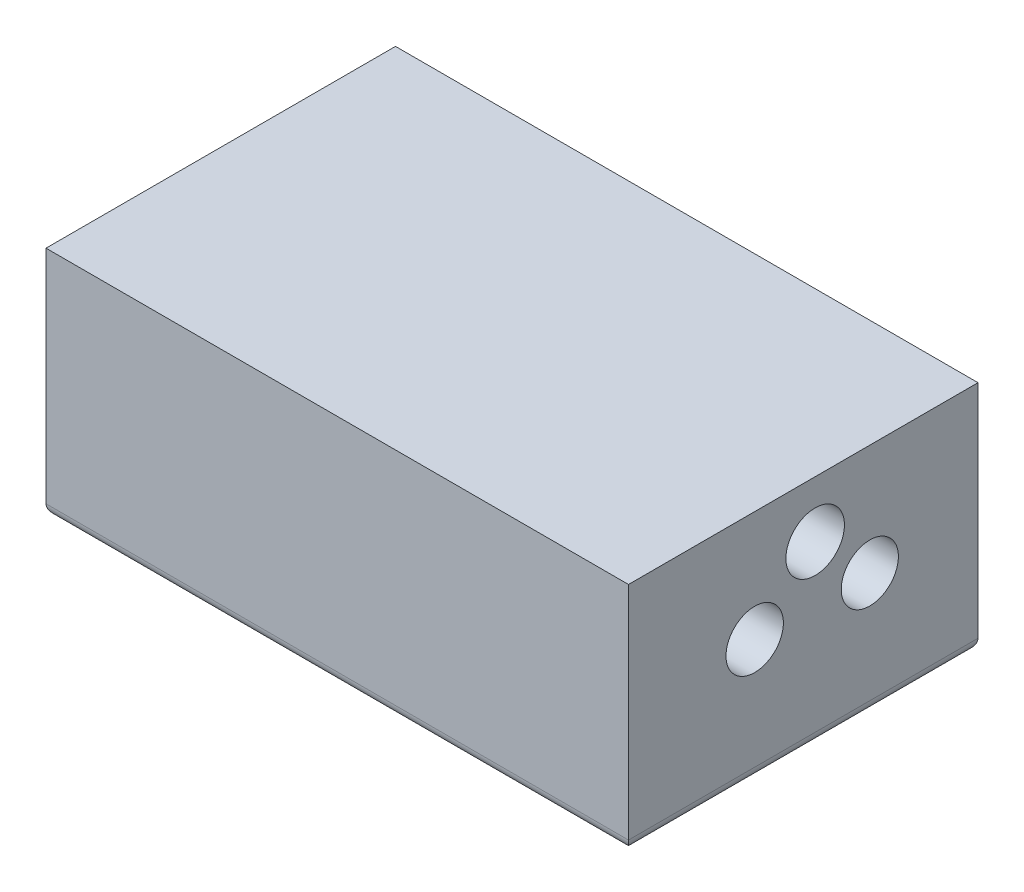
ISO-10303-21;
HEADER;
FILE_DESCRIPTION(('STEP AP214'),'2;1');
FILE_NAME('part.step','',(''),(''),'','','');
FILE_SCHEMA(('AUTOMOTIVE_DESIGN { 1 0 10303 214 1 1 1 1 }'));
ENDSEC;
DATA;
#1=APPLICATION_CONTEXT('core data for automotive mechanical design processes');
#2=APPLICATION_PROTOCOL_DEFINITION('international standard','automotive_design',2000,#1);
#3=PRODUCT_CONTEXT('',#1,'mechanical');
#4=PRODUCT('Part','Part','',(#3));
#5=PRODUCT_RELATED_PRODUCT_CATEGORY('part','',(#4));
#6=PRODUCT_DEFINITION_FORMATION('','',#4);
#7=PRODUCT_DEFINITION_CONTEXT('part definition',#1,'design');
#8=PRODUCT_DEFINITION('design','',#6,#7);
#9=PRODUCT_DEFINITION_SHAPE('','',#8);
#10=(LENGTH_UNIT() NAMED_UNIT(*) SI_UNIT(.MILLI.,.METRE.));
#11=(NAMED_UNIT(*) PLANE_ANGLE_UNIT() SI_UNIT($,.RADIAN.));
#12=(NAMED_UNIT(*) SI_UNIT($,.STERADIAN.) SOLID_ANGLE_UNIT());
#13=UNCERTAINTY_MEASURE_WITH_UNIT(LENGTH_MEASURE(1.E-05),#10,'distance_accuracy_value','');
#14=(GEOMETRIC_REPRESENTATION_CONTEXT(3) GLOBAL_UNCERTAINTY_ASSIGNED_CONTEXT((#13)) GLOBAL_UNIT_ASSIGNED_CONTEXT((#10,
#11,#12)) REPRESENTATION_CONTEXT('',''));
#15=CARTESIAN_POINT('',(0.,0.,0.));
#16=DIRECTION('',(0.,0.,1.));
#17=DIRECTION('',(1.,0.,0.));
#18=AXIS2_PLACEMENT_3D('',#15,#16,#17);
#19=CARTESIAN_POINT('',(-63.5,50.8,-38.1));
#20=DIRECTION('',(1.,0.,0.));
#21=DIRECTION('',(0.,0.,-1.));
#22=AXIS2_PLACEMENT_3D('',#19,#20,#21);
#23=PLANE('',#22);
#24=DIRECTION('',(0.,-1.,0.));
#25=VECTOR('',#24,1.);
#26=CARTESIAN_POINT('',(-63.5,50.8,-38.1));
#27=LINE('',#26,#25);
#28=CARTESIAN_POINT('',(-63.5,50.8,-38.1));
#29=VERTEX_POINT('',#28);
#30=CARTESIAN_POINT('',(-63.5,2.54,-38.1));
#31=VERTEX_POINT('',#30);
#32=EDGE_CURVE('E159',#29,#31,#27,.T.);
#33=ORIENTED_EDGE('',*,*,#32,.T.);
#34=DIRECTION('',(0.,0.,1.));
#35=VECTOR('',#34,1.);
#36=CARTESIAN_POINT('',(-63.5,2.54,-38.1));
#37=LINE('',#36,#35);
#38=CARTESIAN_POINT('',(-63.5,2.54,38.1));
#39=VERTEX_POINT('',#38);
#40=EDGE_CURVE('E59',#31,#39,#37,.T.);
#41=ORIENTED_EDGE('',*,*,#40,.T.);
#42=DIRECTION('',(0.,-1.,0.));
#43=VECTOR('',#42,1.);
#44=CARTESIAN_POINT('',(-63.5,50.8,38.1));
#45=LINE('',#44,#43);
#46=CARTESIAN_POINT('',(-63.5,50.8,38.1));
#47=VERTEX_POINT('',#46);
#48=EDGE_CURVE('E91',#47,#39,#45,.T.);
#49=ORIENTED_EDGE('',*,*,#48,.F.);
#50=DIRECTION('',(0.,0.,1.));
#51=VECTOR('',#50,1.);
#52=CARTESIAN_POINT('',(-63.5,50.8,-38.1));
#53=LINE('',#52,#51);
#54=EDGE_CURVE('E96',#29,#47,#53,.T.);
#55=ORIENTED_EDGE('',*,*,#54,.F.);
#56=EDGE_LOOP('',(#33,#41,#49,#55));
#57=FACE_BOUND('',#56,.T.);
#58=ADVANCED_FACE('F35',(#57),#23,.F.);
#59=CARTESIAN_POINT('',(-63.5,50.8,38.1));
#60=DIRECTION('',(0.,0.,-1.));
#61=DIRECTION('',(-1.,0.,0.));
#62=AXIS2_PLACEMENT_3D('',#59,#60,#61);
#63=PLANE('',#62);
#64=ORIENTED_EDGE('',*,*,#48,.T.);
#65=DIRECTION('',(1.,0.,0.));
#66=VECTOR('',#65,1.);
#67=CARTESIAN_POINT('',(-63.5,2.54,38.1));
#68=LINE('',#67,#66);
#69=CARTESIAN_POINT('',(63.5,2.54,38.1));
#70=VERTEX_POINT('',#69);
#71=EDGE_CURVE('E44',#39,#70,#68,.T.);
#72=ORIENTED_EDGE('',*,*,#71,.T.);
#73=DIRECTION('',(0.,-1.,0.));
#74=VECTOR('',#73,1.);
#75=CARTESIAN_POINT('',(63.5,50.8,38.1));
#76=LINE('',#75,#74);
#77=CARTESIAN_POINT('',(63.5,50.8,38.1));
#78=VERTEX_POINT('',#77);
#79=EDGE_CURVE('E92',#78,#70,#76,.T.);
#80=ORIENTED_EDGE('',*,*,#79,.F.);
#81=DIRECTION('',(1.,0.,0.));
#82=VECTOR('',#81,1.);
#83=CARTESIAN_POINT('',(-63.5,50.8,38.1));
#84=LINE('',#83,#82);
#85=EDGE_CURVE('E88',#47,#78,#84,.T.);
#86=ORIENTED_EDGE('',*,*,#85,.F.);
#87=EDGE_LOOP('',(#64,#72,#80,#86));
#88=FACE_BOUND('',#87,.T.);
#89=ADVANCED_FACE('F90',(#88),#63,.F.);
#90=CARTESIAN_POINT('',(63.5,50.8,-38.1));
#91=DIRECTION('',(-1.,0.,0.));
#92=DIRECTION('',(0.,0.,1.));
#93=AXIS2_PLACEMENT_3D('',#90,#91,#92);
#94=PLANE('',#93);
#95=CARTESIAN_POINT('',(63.5,38.5286638569227,-2.59811340141347));
#96=DIRECTION('',(1.,0.,0.));
#97=DIRECTION('',(0.,0.,-1.));
#98=AXIS2_PLACEMENT_3D('',#95,#96,#97);
#99=CIRCLE('',#98,6.38236986153384);
#100=CARTESIAN_POINT('',(63.5,38.5286638569227,-8.98048326294731));
#101=VERTEX_POINT('',#100);
#102=EDGE_CURVE('E133',#101,#101,#99,.T.);
#103=ORIENTED_EDGE('',*,*,#102,.F.);
#104=EDGE_LOOP('',(#103));
#105=FACE_BOUND('',#104,.T.);
#106=CARTESIAN_POINT('',(63.5,26.67,-14.5124216809336));
#107=DIRECTION('',(1.,0.,0.));
#108=DIRECTION('',(0.,0.,-1.));
#109=AXIS2_PLACEMENT_3D('',#106,#107,#108);
#110=CIRCLE('',#109,6.233963983332);
#111=CARTESIAN_POINT('',(63.5,26.67,-20.7463856642656));
#112=VERTEX_POINT('',#111);
#113=EDGE_CURVE('E147',#112,#112,#110,.T.);
#114=ORIENTED_EDGE('',*,*,#113,.F.);
#115=EDGE_LOOP('',(#114));
#116=FACE_BOUND('',#115,.T.);
#117=CARTESIAN_POINT('',(63.5,26.67,10.58690142274));
#118=DIRECTION('',(1.,0.,0.));
#119=DIRECTION('',(0.,0.,-1.));
#120=AXIS2_PLACEMENT_3D('',#117,#118,#119);
#121=CIRCLE('',#120,6.26022475948629);
#122=CARTESIAN_POINT('',(63.5,26.67,4.3266766632537));
#123=VERTEX_POINT('',#122);
#124=EDGE_CURVE('E150',#123,#123,#121,.T.);
#125=ORIENTED_EDGE('',*,*,#124,.F.);
#126=EDGE_LOOP('',(#125));
#127=FACE_BOUND('',#126,.T.);
#128=ORIENTED_EDGE('',*,*,#79,.T.);
#129=DIRECTION('',(0.,0.,-1.));
#130=VECTOR('',#129,1.);
#131=CARTESIAN_POINT('',(63.5,2.54,-38.1));
#132=LINE('',#131,#130);
#133=CARTESIAN_POINT('',(63.5,2.54,-38.1));
#134=VERTEX_POINT('',#133);
#135=EDGE_CURVE('E11',#70,#134,#132,.T.);
#136=ORIENTED_EDGE('',*,*,#135,.T.);
#137=DIRECTION('',(0.,-1.,0.));
#138=VECTOR('',#137,1.);
#139=CARTESIAN_POINT('',(63.5,50.8,-38.1));
#140=LINE('',#139,#138);
#141=CARTESIAN_POINT('',(63.5,50.8,-38.1));
#142=VERTEX_POINT('',#141);
#143=EDGE_CURVE('E110',#142,#134,#140,.T.);
#144=ORIENTED_EDGE('',*,*,#143,.F.);
#145=DIRECTION('',(0.,0.,-1.));
#146=VECTOR('',#145,1.);
#147=CARTESIAN_POINT('',(63.5,50.8,-38.1));
#148=LINE('',#147,#146);
#149=EDGE_CURVE('E95',#78,#142,#148,.T.);
#150=ORIENTED_EDGE('',*,*,#149,.F.);
#151=EDGE_LOOP('',(#128,#136,#144,#150));
#152=FACE_BOUND('',#151,.T.);
#153=ADVANCED_FACE('F185',(#105,#116,#127,#152),#94,.F.);
#154=CARTESIAN_POINT('',(-63.5,50.8,-38.1));
#155=DIRECTION('',(0.,0.,1.));
#156=DIRECTION('',(1.,0.,0.));
#157=AXIS2_PLACEMENT_3D('',#154,#155,#156);
#158=PLANE('',#157);
#159=ORIENTED_EDGE('',*,*,#143,.T.);
#160=DIRECTION('',(-1.,0.,0.));
#161=VECTOR('',#160,1.);
#162=CARTESIAN_POINT('',(-63.5,2.54,-38.1));
#163=LINE('',#162,#161);
#164=EDGE_CURVE('E105',#134,#31,#163,.T.);
#165=ORIENTED_EDGE('',*,*,#164,.T.);
#166=ORIENTED_EDGE('',*,*,#32,.F.);
#167=DIRECTION('',(-1.,0.,0.));
#168=VECTOR('',#167,1.);
#169=CARTESIAN_POINT('',(-63.5,50.8,-38.1));
#170=LINE('',#169,#168);
#171=EDGE_CURVE('E101',#142,#29,#170,.T.);
#172=ORIENTED_EDGE('',*,*,#171,.F.);
#173=EDGE_LOOP('',(#159,#165,#166,#172));
#174=FACE_BOUND('',#173,.T.);
#175=ADVANCED_FACE('F164',(#174),#158,.F.);
#176=CARTESIAN_POINT('',(0.,50.8,0.));
#177=DIRECTION('',(0.,1.,0.));
#178=DIRECTION('',(0.,0.,1.));
#179=AXIS2_PLACEMENT_3D('',#176,#177,#178);
#180=PLANE('',#179);
#181=ORIENTED_EDGE('',*,*,#54,.T.);
#182=ORIENTED_EDGE('',*,*,#85,.T.);
#183=ORIENTED_EDGE('',*,*,#149,.T.);
#184=ORIENTED_EDGE('',*,*,#171,.T.);
#185=EDGE_LOOP('',(#181,#182,#183,#184));
#186=FACE_BOUND('',#185,.T.);
#187=ADVANCED_FACE('F99',(#186),#180,.T.);
#188=CARTESIAN_POINT('',(0.,0.,0.));
#189=DIRECTION('',(0.,1.,0.));
#190=DIRECTION('',(0.,0.,1.));
#191=AXIS2_PLACEMENT_3D('',#188,#189,#190);
#192=PLANE('',#191);
#193=DIRECTION('',(0.,0.,1.));
#194=VECTOR('',#193,1.);
#195=CARTESIAN_POINT('',(-60.96,0.,0.));
#196=LINE('',#195,#194);
#197=CARTESIAN_POINT('',(-60.96,0.,35.56));
#198=VERTEX_POINT('',#197);
#199=CARTESIAN_POINT('',(-60.96,0.,-35.56));
#200=VERTEX_POINT('',#199);
#201=EDGE_CURVE('E117',#198,#200,#196,.F.);
#202=ORIENTED_EDGE('',*,*,#201,.T.);
#203=DIRECTION('',(-1.,0.,0.));
#204=VECTOR('',#203,1.);
#205=CARTESIAN_POINT('',(0.,0.,-35.56));
#206=LINE('',#205,#204);
#207=CARTESIAN_POINT('',(60.96,0.,-35.56));
#208=VERTEX_POINT('',#207);
#209=EDGE_CURVE('E119',#200,#208,#206,.F.);
#210=ORIENTED_EDGE('',*,*,#209,.T.);
#211=DIRECTION('',(0.,0.,-1.));
#212=VECTOR('',#211,1.);
#213=CARTESIAN_POINT('',(60.96,0.,0.));
#214=LINE('',#213,#212);
#215=CARTESIAN_POINT('',(60.96,0.,35.56));
#216=VERTEX_POINT('',#215);
#217=EDGE_CURVE('E108',#208,#216,#214,.F.);
#218=ORIENTED_EDGE('',*,*,#217,.T.);
#219=DIRECTION('',(1.,0.,0.));
#220=VECTOR('',#219,1.);
#221=CARTESIAN_POINT('',(0.,0.,35.56));
#222=LINE('',#221,#220);
#223=EDGE_CURVE('E115',#216,#198,#222,.F.);
#224=ORIENTED_EDGE('',*,*,#223,.T.);
#225=EDGE_LOOP('',(#202,#210,#218,#224));
#226=FACE_BOUND('',#225,.T.);
#227=ADVANCED_FACE('F193',(#226),#192,.F.);
#228=CARTESIAN_POINT('',(48.26,26.67,10.58690142274));
#229=DIRECTION('',(1.,0.,0.));
#230=DIRECTION('',(0.,0.,-1.));
#231=AXIS2_PLACEMENT_3D('',#228,#229,#230);
#232=CYLINDRICAL_SURFACE('',#231,6.26022475948629);
#233=CARTESIAN_POINT('',(48.26,26.67,10.58690142274));
#234=DIRECTION('',(1.,0.,0.));
#235=DIRECTION('',(0.,0.,-1.));
#236=AXIS2_PLACEMENT_3D('',#233,#234,#235);
#237=CIRCLE('',#236,6.26022475948629);
#238=CARTESIAN_POINT('',(48.26,26.67,4.3266766632537));
#239=VERTEX_POINT('',#238);
#240=EDGE_CURVE('E103',#239,#239,#237,.T.);
#241=CARTESIAN_POINT('',(48.26,26.67,4.3266766632537));
#242=CARTESIAN_POINT('',(48.41875,26.67,4.3266766632537));
#243=CARTESIAN_POINT('',(48.5775,26.67,4.3266766632537));
#244=CARTESIAN_POINT('',(48.895,26.67,4.3266766632537));
#245=CARTESIAN_POINT('',(49.05375,26.67,4.3266766632537));
#246=CARTESIAN_POINT('',(49.37125,26.67,4.3266766632537));
#247=CARTESIAN_POINT('',(49.53,26.67,4.3266766632537));
#248=CARTESIAN_POINT('',(49.8475,26.67,4.3266766632537));
#249=CARTESIAN_POINT('',(50.00625,26.67,4.3266766632537));
#250=CARTESIAN_POINT('',(50.32375,26.67,4.3266766632537));
#251=CARTESIAN_POINT('',(50.4825,26.67,4.3266766632537));
#252=CARTESIAN_POINT('',(50.8,26.67,4.3266766632537));
#253=CARTESIAN_POINT('',(50.95875,26.67,4.3266766632537));
#254=CARTESIAN_POINT('',(51.27625,26.67,4.3266766632537));
#255=CARTESIAN_POINT('',(51.435,26.67,4.3266766632537));
#256=CARTESIAN_POINT('',(51.7525,26.67,4.3266766632537));
#257=CARTESIAN_POINT('',(51.91125,26.67,4.3266766632537));
#258=CARTESIAN_POINT('',(52.22875,26.67,4.3266766632537));
#259=CARTESIAN_POINT('',(52.3875,26.67,4.3266766632537));
#260=CARTESIAN_POINT('',(52.705,26.67,4.3266766632537));
#261=CARTESIAN_POINT('',(52.86375,26.67,4.3266766632537));
#262=CARTESIAN_POINT('',(53.18125,26.67,4.3266766632537));
#263=CARTESIAN_POINT('',(53.34,26.67,4.3266766632537));
#264=CARTESIAN_POINT('',(53.6575,26.67,4.3266766632537));
#265=CARTESIAN_POINT('',(53.81625,26.67,4.3266766632537));
#266=CARTESIAN_POINT('',(54.13375,26.67,4.3266766632537));
#267=CARTESIAN_POINT('',(54.2925,26.67,4.3266766632537));
#268=CARTESIAN_POINT('',(54.61,26.67,4.3266766632537));
#269=CARTESIAN_POINT('',(54.76875,26.67,4.3266766632537));
#270=CARTESIAN_POINT('',(55.08625,26.67,4.3266766632537));
#271=CARTESIAN_POINT('',(55.245,26.67,4.3266766632537));
#272=CARTESIAN_POINT('',(55.5625,26.67,4.3266766632537));
#273=CARTESIAN_POINT('',(55.72125,26.67,4.3266766632537));
#274=CARTESIAN_POINT('',(56.03875,26.67,4.3266766632537));
#275=CARTESIAN_POINT('',(56.1975,26.67,4.3266766632537));
#276=CARTESIAN_POINT('',(56.515,26.67,4.3266766632537));
#277=CARTESIAN_POINT('',(56.67375,26.67,4.3266766632537));
#278=CARTESIAN_POINT('',(56.99125,26.67,4.3266766632537));
#279=CARTESIAN_POINT('',(57.15,26.67,4.3266766632537));
#280=CARTESIAN_POINT('',(57.4675,26.67,4.3266766632537));
#281=CARTESIAN_POINT('',(57.62625,26.67,4.3266766632537));
#282=CARTESIAN_POINT('',(57.94375,26.67,4.3266766632537));
#283=CARTESIAN_POINT('',(58.1025,26.67,4.3266766632537));
#284=CARTESIAN_POINT('',(58.42,26.67,4.3266766632537));
#285=CARTESIAN_POINT('',(58.57875,26.67,4.3266766632537));
#286=CARTESIAN_POINT('',(58.89625,26.67,4.3266766632537));
#287=CARTESIAN_POINT('',(59.055,26.67,4.3266766632537));
#288=CARTESIAN_POINT('',(59.3725,26.67,4.3266766632537));
#289=CARTESIAN_POINT('',(59.53125,26.67,4.3266766632537));
#290=CARTESIAN_POINT('',(59.84875,26.67,4.3266766632537));
#291=CARTESIAN_POINT('',(60.0075,26.67,4.3266766632537));
#292=CARTESIAN_POINT('',(60.325,26.67,4.3266766632537));
#293=CARTESIAN_POINT('',(60.48375,26.67,4.3266766632537));
#294=CARTESIAN_POINT('',(60.80125,26.67,4.3266766632537));
#295=CARTESIAN_POINT('',(60.96,26.67,4.3266766632537));
#296=CARTESIAN_POINT('',(61.2775,26.67,4.3266766632537));
#297=CARTESIAN_POINT('',(61.43625,26.67,4.3266766632537));
#298=CARTESIAN_POINT('',(61.75375,26.67,4.3266766632537));
#299=CARTESIAN_POINT('',(61.9125,26.67,4.3266766632537));
#300=CARTESIAN_POINT('',(62.23,26.67,4.3266766632537));
#301=CARTESIAN_POINT('',(62.38875,26.67,4.3266766632537));
#302=CARTESIAN_POINT('',(62.70625,26.67,4.3266766632537));
#303=CARTESIAN_POINT('',(62.865,26.67,4.3266766632537));
#304=CARTESIAN_POINT('',(63.1825,26.67,4.3266766632537));
#305=CARTESIAN_POINT('',(63.34125,26.67,4.3266766632537));
#306=CARTESIAN_POINT('',(63.5,26.67,4.3266766632537));
#307=B_SPLINE_CURVE_WITH_KNOTS('',3,(#241,#242,#243,#244,#245,#246,#247,#248,#249,#250,#251,
#252,#253,#254,#255,#256,#257,#258,#259,#260,#261,#262,#263,#264,#265,#266,#267,#268,#269,#270,
#271,#272,#273,#274,#275,#276,#277,#278,#279,#280,#281,#282,#283,#284,#285,#286,#287,#288,#289,
#290,#291,#292,#293,#294,#295,#296,#297,#298,#299,#300,#301,#302,#303,#304,#305,#306),
.UNSPECIFIED.,.F.,.F.,(4,2,2,2,2,2,2,2,2,2,2,2,2,2,2,2,2,2,2,2,2,2,2,2,2,2,2,2,2,2,2,2,4),(0.,
0.476250000000004,0.952500000000002,1.42875000000001,1.905,2.38125,2.85750000000001,3.33375,
3.81,4.28625000000001,4.7625,5.23875000000001,5.71500000000001,6.19125,6.66750000000001,7.14375,
7.62,8.09625000000001,8.5725,9.04875,9.52500000000001,10.00125,10.4775,10.95375,11.43,11.90625,
12.3825,12.85875,13.335,13.81125,14.2875,14.76375,15.24),.UNSPECIFIED.);
#308=EDGE_CURVE('BSEAM196',#239,#123,#307,.T.);
#309=ORIENTED_EDGE('',*,*,#240,.F.);
#310=ORIENTED_EDGE('',*,*,#124,.T.);
#311=ORIENTED_EDGE('',*,*,#308,.T.);
#312=ORIENTED_EDGE('',*,*,#308,.F.);
#313=EDGE_LOOP('',(#309,#311,#310,#312));
#314=FACE_BOUND('',#313,.T.);
#315=ADVANCED_FACE('F196',(#314),#232,.F.);
#316=CARTESIAN_POINT('',(48.26,26.67,10.58690142274));
#317=DIRECTION('',(1.,0.,0.));
#318=DIRECTION('',(0.,0.,-1.));
#319=AXIS2_PLACEMENT_3D('',#316,#317,#318);
#320=PLANE('',#319);
#321=ORIENTED_EDGE('',*,*,#240,.T.);
#322=EDGE_LOOP('',(#321));
#323=FACE_BOUND('',#322,.T.);
#324=ADVANCED_FACE('F202',(#323),#320,.T.);
#325=CARTESIAN_POINT('',(48.26,26.67,-14.5124216809336));
#326=DIRECTION('',(1.,0.,0.));
#327=DIRECTION('',(0.,0.,-1.));
#328=AXIS2_PLACEMENT_3D('',#325,#326,#327);
#329=CYLINDRICAL_SURFACE('',#328,6.233963983332);
#330=CARTESIAN_POINT('',(48.26,26.67,-14.5124216809336));
#331=DIRECTION('',(1.,0.,0.));
#332=DIRECTION('',(0.,0.,-1.));
#333=AXIS2_PLACEMENT_3D('',#330,#331,#332);
#334=CIRCLE('',#333,6.233963983332);
#335=CARTESIAN_POINT('',(48.26,26.67,-20.7463856642656));
#336=VERTEX_POINT('',#335);
#337=EDGE_CURVE('E144',#336,#336,#334,.T.);
#338=CARTESIAN_POINT('',(48.26,26.67,-20.7463856642656));
#339=CARTESIAN_POINT('',(48.41875,26.67,-20.7463856642656));
#340=CARTESIAN_POINT('',(48.5775,26.67,-20.7463856642656));
#341=CARTESIAN_POINT('',(48.895,26.67,-20.7463856642656));
#342=CARTESIAN_POINT('',(49.05375,26.67,-20.7463856642656));
#343=CARTESIAN_POINT('',(49.37125,26.67,-20.7463856642656));
#344=CARTESIAN_POINT('',(49.53,26.67,-20.7463856642656));
#345=CARTESIAN_POINT('',(49.8475,26.67,-20.7463856642656));
#346=CARTESIAN_POINT('',(50.00625,26.67,-20.7463856642656));
#347=CARTESIAN_POINT('',(50.32375,26.67,-20.7463856642656));
#348=CARTESIAN_POINT('',(50.4825,26.67,-20.7463856642656));
#349=CARTESIAN_POINT('',(50.8,26.67,-20.7463856642656));
#350=CARTESIAN_POINT('',(50.95875,26.67,-20.7463856642656));
#351=CARTESIAN_POINT('',(51.27625,26.67,-20.7463856642656));
#352=CARTESIAN_POINT('',(51.435,26.67,-20.7463856642656));
#353=CARTESIAN_POINT('',(51.7525,26.67,-20.7463856642656));
#354=CARTESIAN_POINT('',(51.91125,26.67,-20.7463856642656));
#355=CARTESIAN_POINT('',(52.22875,26.67,-20.7463856642656));
#356=CARTESIAN_POINT('',(52.3875,26.67,-20.7463856642656));
#357=CARTESIAN_POINT('',(52.705,26.67,-20.7463856642656));
#358=CARTESIAN_POINT('',(52.86375,26.67,-20.7463856642656));
#359=CARTESIAN_POINT('',(53.18125,26.67,-20.7463856642656));
#360=CARTESIAN_POINT('',(53.34,26.67,-20.7463856642656));
#361=CARTESIAN_POINT('',(53.6575,26.67,-20.7463856642656));
#362=CARTESIAN_POINT('',(53.81625,26.67,-20.7463856642656));
#363=CARTESIAN_POINT('',(54.13375,26.67,-20.7463856642656));
#364=CARTESIAN_POINT('',(54.2925,26.67,-20.7463856642656));
#365=CARTESIAN_POINT('',(54.61,26.67,-20.7463856642656));
#366=CARTESIAN_POINT('',(54.76875,26.67,-20.7463856642656));
#367=CARTESIAN_POINT('',(55.08625,26.67,-20.7463856642656));
#368=CARTESIAN_POINT('',(55.245,26.67,-20.7463856642656));
#369=CARTESIAN_POINT('',(55.5625,26.67,-20.7463856642656));
#370=CARTESIAN_POINT('',(55.72125,26.67,-20.7463856642656));
#371=CARTESIAN_POINT('',(56.03875,26.67,-20.7463856642656));
#372=CARTESIAN_POINT('',(56.1975,26.67,-20.7463856642656));
#373=CARTESIAN_POINT('',(56.515,26.67,-20.7463856642656));
#374=CARTESIAN_POINT('',(56.67375,26.67,-20.7463856642656));
#375=CARTESIAN_POINT('',(56.99125,26.67,-20.7463856642656));
#376=CARTESIAN_POINT('',(57.15,26.67,-20.7463856642656));
#377=CARTESIAN_POINT('',(57.4675,26.67,-20.7463856642656));
#378=CARTESIAN_POINT('',(57.62625,26.67,-20.7463856642656));
#379=CARTESIAN_POINT('',(57.94375,26.67,-20.7463856642656));
#380=CARTESIAN_POINT('',(58.1025,26.67,-20.7463856642656));
#381=CARTESIAN_POINT('',(58.42,26.67,-20.7463856642656));
#382=CARTESIAN_POINT('',(58.57875,26.67,-20.7463856642656));
#383=CARTESIAN_POINT('',(58.89625,26.67,-20.7463856642656));
#384=CARTESIAN_POINT('',(59.055,26.67,-20.7463856642656));
#385=CARTESIAN_POINT('',(59.3725,26.67,-20.7463856642656));
#386=CARTESIAN_POINT('',(59.53125,26.67,-20.7463856642656));
#387=CARTESIAN_POINT('',(59.84875,26.67,-20.7463856642656));
#388=CARTESIAN_POINT('',(60.0075,26.67,-20.7463856642656));
#389=CARTESIAN_POINT('',(60.325,26.67,-20.7463856642656));
#390=CARTESIAN_POINT('',(60.48375,26.67,-20.7463856642656));
#391=CARTESIAN_POINT('',(60.80125,26.67,-20.7463856642656));
#392=CARTESIAN_POINT('',(60.96,26.67,-20.7463856642656));
#393=CARTESIAN_POINT('',(61.2775,26.67,-20.7463856642656));
#394=CARTESIAN_POINT('',(61.43625,26.67,-20.7463856642656));
#395=CARTESIAN_POINT('',(61.75375,26.67,-20.7463856642656));
#396=CARTESIAN_POINT('',(61.9125,26.67,-20.7463856642656));
#397=CARTESIAN_POINT('',(62.23,26.67,-20.7463856642656));
#398=CARTESIAN_POINT('',(62.38875,26.67,-20.7463856642656));
#399=CARTESIAN_POINT('',(62.70625,26.67,-20.7463856642656));
#400=CARTESIAN_POINT('',(62.865,26.67,-20.7463856642656));
#401=CARTESIAN_POINT('',(63.1825,26.67,-20.7463856642656));
#402=CARTESIAN_POINT('',(63.34125,26.67,-20.7463856642656));
#403=CARTESIAN_POINT('',(63.5,26.67,-20.7463856642656));
#404=B_SPLINE_CURVE_WITH_KNOTS('',3,(#338,#339,#340,#341,#342,#343,#344,#345,#346,#347,#348,
#349,#350,#351,#352,#353,#354,#355,#356,#357,#358,#359,#360,#361,#362,#363,#364,#365,#366,#367,
#368,#369,#370,#371,#372,#373,#374,#375,#376,#377,#378,#379,#380,#381,#382,#383,#384,#385,#386,
#387,#388,#389,#390,#391,#392,#393,#394,#395,#396,#397,#398,#399,#400,#401,#402,#403),
.UNSPECIFIED.,.F.,.F.,(4,2,2,2,2,2,2,2,2,2,2,2,2,2,2,2,2,2,2,2,2,2,2,2,2,2,2,2,2,2,2,2,4),(0.,
0.476250000000004,0.952500000000002,1.42875000000001,1.905,2.38125,2.85750000000001,3.33375,
3.81,4.28625000000001,4.7625,5.23875000000001,5.71500000000001,6.19125,6.66750000000001,7.14375,
7.62,8.09625000000001,8.5725,9.04875,9.52500000000001,10.00125,10.4775,10.95375,11.43,11.90625,
12.3825,12.85875,13.335,13.81125,14.2875,14.76375,15.24),.UNSPECIFIED.);
#405=EDGE_CURVE('BSEAM206',#336,#112,#404,.T.);
#406=ORIENTED_EDGE('',*,*,#337,.F.);
#407=ORIENTED_EDGE('',*,*,#113,.T.);
#408=ORIENTED_EDGE('',*,*,#405,.T.);
#409=ORIENTED_EDGE('',*,*,#405,.F.);
#410=EDGE_LOOP('',(#406,#408,#407,#409));
#411=FACE_BOUND('',#410,.T.);
#412=ADVANCED_FACE('F206',(#411),#329,.F.);
#413=CARTESIAN_POINT('',(48.26,26.67,-14.5124216809336));
#414=DIRECTION('',(1.,0.,0.));
#415=DIRECTION('',(0.,0.,-1.));
#416=AXIS2_PLACEMENT_3D('',#413,#414,#415);
#417=PLANE('',#416);
#418=ORIENTED_EDGE('',*,*,#337,.T.);
#419=EDGE_LOOP('',(#418));
#420=FACE_BOUND('',#419,.T.);
#421=ADVANCED_FACE('F208',(#420),#417,.T.);
#422=CARTESIAN_POINT('',(53.34,38.5286638569227,-2.59811340141347));
#423=DIRECTION('',(1.,0.,0.));
#424=DIRECTION('',(0.,0.,-1.));
#425=AXIS2_PLACEMENT_3D('',#422,#423,#424);
#426=CYLINDRICAL_SURFACE('',#425,6.38236986153384);
#427=CARTESIAN_POINT('',(53.34,38.5286638569227,-2.59811340141347));
#428=DIRECTION('',(1.,0.,0.));
#429=DIRECTION('',(0.,0.,-1.));
#430=AXIS2_PLACEMENT_3D('',#427,#428,#429);
#431=CIRCLE('',#430,6.38236986153384);
#432=CARTESIAN_POINT('',(53.34,38.5286638569227,-8.98048326294731));
#433=VERTEX_POINT('',#432);
#434=EDGE_CURVE('E139',#433,#433,#431,.T.);
#435=ORIENTED_EDGE('',*,*,#434,.F.);
#436=EDGE_LOOP('',(#435));
#437=FACE_BOUND('',#436,.T.);
#438=ORIENTED_EDGE('',*,*,#102,.T.);
#439=EDGE_LOOP('',(#438));
#440=FACE_BOUND('',#439,.T.);
#441=ADVANCED_FACE('F211',(#437,#440),#426,.F.);
#442=CARTESIAN_POINT('',(53.34,38.5286638569227,-2.59811340141347));
#443=DIRECTION('',(1.,0.,0.));
#444=DIRECTION('',(0.,0.,-1.));
#445=AXIS2_PLACEMENT_3D('',#442,#443,#444);
#446=PLANE('',#445);
#447=ORIENTED_EDGE('',*,*,#434,.T.);
#448=EDGE_LOOP('',(#447));
#449=FACE_BOUND('',#448,.T.);
#450=ADVANCED_FACE('F218',(#449),#446,.T.);
#451=CARTESIAN_POINT('',(-63.5,2.54,35.56));
#452=DIRECTION('',(1.,0.,0.));
#453=DIRECTION('',(0.,0.,-1.));
#454=AXIS2_PLACEMENT_3D('',#451,#452,#453);
#455=CYLINDRICAL_SURFACE('',#454,2.54);
#456=CARTESIAN_POINT('',(-60.96,2.54,35.56));
#457=DIRECTION('',(0.707106781186547,0.,0.707106781186547));
#458=DIRECTION('',(0.707106781186547,0.,-0.707106781186547));
#459=AXIS2_PLACEMENT_3D('',#456,#457,#458);
#460=ELLIPSE('',#459,3.59210244842766,2.54);
#461=EDGE_CURVE('E127',#198,#39,#460,.F.);
#462=ORIENTED_EDGE('',*,*,#461,.F.);
#463=ORIENTED_EDGE('',*,*,#223,.F.);
#464=CARTESIAN_POINT('',(60.96,2.54,35.56));
#465=DIRECTION('',(0.707106781186547,0.,-0.707106781186547));
#466=DIRECTION('',(-0.707106781186547,0.,-0.707106781186547));
#467=AXIS2_PLACEMENT_3D('',#464,#465,#466);
#468=ELLIPSE('',#467,3.59210244842766,2.54);
#469=EDGE_CURVE('E39',#70,#216,#468,.T.);
#470=ORIENTED_EDGE('',*,*,#469,.F.);
#471=ORIENTED_EDGE('',*,*,#71,.F.);
#472=EDGE_LOOP('',(#462,#463,#470,#471));
#473=FACE_BOUND('',#472,.T.);
#474=ADVANCED_FACE('F37',(#473),#455,.T.);
#475=CARTESIAN_POINT('',(60.96,2.54,-38.1));
#476=DIRECTION('',(0.,0.,-1.));
#477=DIRECTION('',(-1.,0.,0.));
#478=AXIS2_PLACEMENT_3D('',#475,#476,#477);
#479=CYLINDRICAL_SURFACE('',#478,2.54);
#480=ORIENTED_EDGE('',*,*,#469,.T.);
#481=ORIENTED_EDGE('',*,*,#217,.F.);
#482=CARTESIAN_POINT('',(60.96,2.54,-35.56));
#483=DIRECTION('',(-0.707106781186547,0.,-0.707106781186547));
#484=DIRECTION('',(0.707106781186547,0.,-0.707106781186547));
#485=AXIS2_PLACEMENT_3D('',#482,#483,#484);
#486=ELLIPSE('',#485,3.59210244842766,2.54);
#487=EDGE_CURVE('E126',#134,#208,#486,.T.);
#488=ORIENTED_EDGE('',*,*,#487,.F.);
#489=ORIENTED_EDGE('',*,*,#135,.F.);
#490=EDGE_LOOP('',(#480,#481,#488,#489));
#491=FACE_BOUND('',#490,.T.);
#492=ADVANCED_FACE('F167',(#491),#479,.T.);
#493=CARTESIAN_POINT('',(-60.96,2.54,-38.1));
#494=DIRECTION('',(0.,0.,1.));
#495=DIRECTION('',(1.,0.,0.));
#496=AXIS2_PLACEMENT_3D('',#493,#494,#495);
#497=CYLINDRICAL_SURFACE('',#496,2.54);
#498=ORIENTED_EDGE('',*,*,#461,.T.);
#499=ORIENTED_EDGE('',*,*,#40,.F.);
#500=CARTESIAN_POINT('',(-60.96,2.54,-35.56));
#501=DIRECTION('',(-0.707106781186547,0.,0.707106781186547));
#502=DIRECTION('',(0.707106781186547,0.,0.707106781186547));
#503=AXIS2_PLACEMENT_3D('',#500,#501,#502);
#504=ELLIPSE('',#503,3.59210244842766,2.54);
#505=EDGE_CURVE('E124',#200,#31,#504,.F.);
#506=ORIENTED_EDGE('',*,*,#505,.F.);
#507=ORIENTED_EDGE('',*,*,#201,.F.);
#508=EDGE_LOOP('',(#498,#499,#506,#507));
#509=FACE_BOUND('',#508,.T.);
#510=ADVANCED_FACE('F172',(#509),#497,.T.);
#511=CARTESIAN_POINT('',(-63.5,2.54,-35.56));
#512=DIRECTION('',(-1.,0.,0.));
#513=DIRECTION('',(0.,0.,1.));
#514=AXIS2_PLACEMENT_3D('',#511,#512,#513);
#515=CYLINDRICAL_SURFACE('',#514,2.54);
#516=ORIENTED_EDGE('',*,*,#487,.T.);
#517=ORIENTED_EDGE('',*,*,#209,.F.);
#518=ORIENTED_EDGE('',*,*,#505,.T.);
#519=ORIENTED_EDGE('',*,*,#164,.F.);
#520=EDGE_LOOP('',(#516,#517,#518,#519));
#521=FACE_BOUND('',#520,.T.);
#522=ADVANCED_FACE('F170',(#521),#515,.T.);
#523=CLOSED_SHELL('',(#58,#89,#153,#175,#187,#227,#315,#324,#412,#421,#441,#450,#474,#492,#510,#522));
#524=MANIFOLD_SOLID_BREP('B2',#523);
#525=ADVANCED_BREP_SHAPE_REPRESENTATION('',(#18,#524),#14);
#526=SHAPE_DEFINITION_REPRESENTATION(#9,#525);
ENDSEC;
END-ISO-10303-21;
